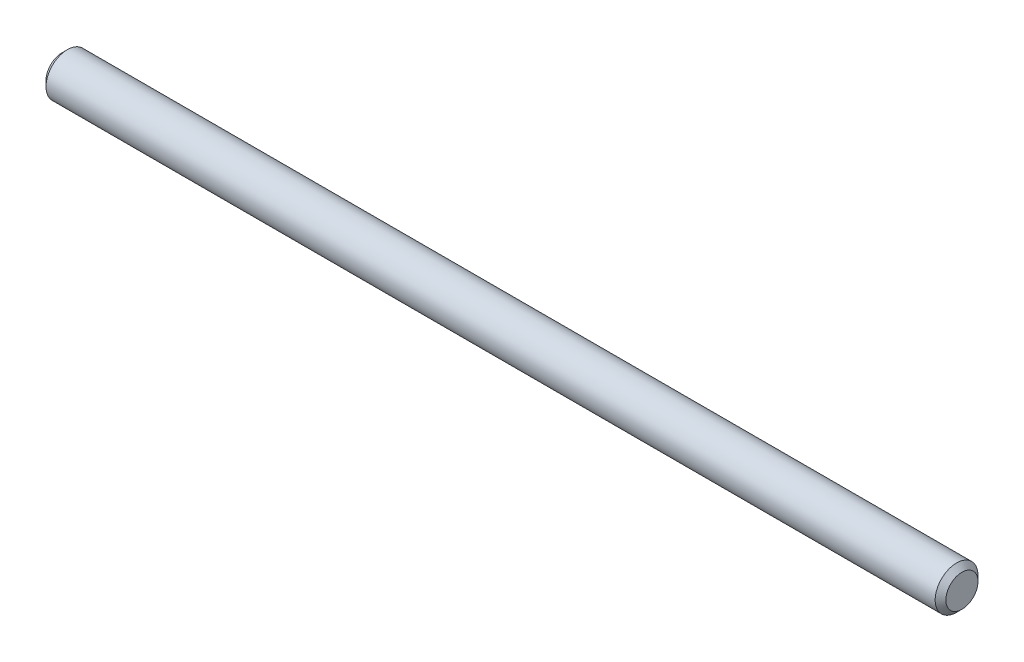
ISO-10303-21;
HEADER;
FILE_DESCRIPTION(('STEP AP214'),'2;1');
FILE_NAME('part.step','',(''),(''),'','','');
FILE_SCHEMA(('AUTOMOTIVE_DESIGN { 1 0 10303 214 1 1 1 1 }'));
ENDSEC;
DATA;
#1=APPLICATION_CONTEXT('core data for automotive mechanical design processes');
#2=APPLICATION_PROTOCOL_DEFINITION('international standard','automotive_design',2000,#1);
#3=PRODUCT_CONTEXT('',#1,'mechanical');
#4=PRODUCT('Part','Part','',(#3));
#5=PRODUCT_RELATED_PRODUCT_CATEGORY('part','',(#4));
#6=PRODUCT_DEFINITION_FORMATION('','',#4);
#7=PRODUCT_DEFINITION_CONTEXT('part definition',#1,'design');
#8=PRODUCT_DEFINITION('design','',#6,#7);
#9=PRODUCT_DEFINITION_SHAPE('','',#8);
#10=(LENGTH_UNIT() NAMED_UNIT(*) SI_UNIT(.MILLI.,.METRE.));
#11=(NAMED_UNIT(*) PLANE_ANGLE_UNIT() SI_UNIT($,.RADIAN.));
#12=(NAMED_UNIT(*) SI_UNIT($,.STERADIAN.) SOLID_ANGLE_UNIT());
#13=UNCERTAINTY_MEASURE_WITH_UNIT(LENGTH_MEASURE(1.E-05),#10,'distance_accuracy_value','');
#14=(GEOMETRIC_REPRESENTATION_CONTEXT(3) GLOBAL_UNCERTAINTY_ASSIGNED_CONTEXT((#13)) GLOBAL_UNIT_ASSIGNED_CONTEXT((#10,
#11,#12)) REPRESENTATION_CONTEXT('',''));
#15=CARTESIAN_POINT('',(0.,0.,0.));
#16=DIRECTION('',(0.,0.,1.));
#17=DIRECTION('',(1.,0.,0.));
#18=AXIS2_PLACEMENT_3D('',#15,#16,#17);
#19=CARTESIAN_POINT('',(42.,0.,0.));
#20=DIRECTION('',(-1.,0.,0.));
#21=DIRECTION('',(0.,0.,1.));
#22=AXIS2_PLACEMENT_3D('',#19,#20,#21);
#23=CYLINDRICAL_SURFACE('',#22,2.);
#24=CARTESIAN_POINT('',(-41.4999999999999,0.,0.));
#25=DIRECTION('',(1.,0.,0.));
#26=DIRECTION('',(0.,0.,-1.));
#27=AXIS2_PLACEMENT_3D('',#24,#25,#26);
#28=CIRCLE('',#27,2.);
#29=CARTESIAN_POINT('',(-41.4999999999999,0.,2.));
#30=VERTEX_POINT('',#29);
#31=EDGE_CURVE('E45',#30,#30,#28,.T.);
#32=CARTESIAN_POINT('',(41.5,0.,0.));
#33=DIRECTION('',(1.,0.,0.));
#34=DIRECTION('',(0.,0.,-1.));
#35=AXIS2_PLACEMENT_3D('',#32,#33,#34);
#36=CIRCLE('',#35,2.);
#37=CARTESIAN_POINT('',(41.5,0.,2.));
#38=VERTEX_POINT('',#37);
#39=EDGE_CURVE('E49',#38,#38,#36,.F.);
#40=CARTESIAN_POINT('',(-41.4999999999999,0.,2.));
#41=CARTESIAN_POINT('',(-40.6354166666666,0.,2.));
#42=CARTESIAN_POINT('',(-39.7708333333333,0.,2.));
#43=CARTESIAN_POINT('',(-38.0416666666666,0.,2.));
#44=CARTESIAN_POINT('',(-37.1770833333333,0.,2.));
#45=CARTESIAN_POINT('',(-35.4479166666666,0.,2.));
#46=CARTESIAN_POINT('',(-34.5833333333333,0.,2.));
#47=CARTESIAN_POINT('',(-32.8541666666666,0.,2.));
#48=CARTESIAN_POINT('',(-31.9895833333333,0.,2.));
#49=CARTESIAN_POINT('',(-30.2604166666666,0.,2.));
#50=CARTESIAN_POINT('',(-29.3958333333333,0.,2.));
#51=CARTESIAN_POINT('',(-27.6666666666666,0.,2.));
#52=CARTESIAN_POINT('',(-26.8020833333333,0.,2.));
#53=CARTESIAN_POINT('',(-25.0729166666666,0.,2.));
#54=CARTESIAN_POINT('',(-24.2083333333333,0.,2.));
#55=CARTESIAN_POINT('',(-22.4791666666666,0.,2.));
#56=CARTESIAN_POINT('',(-21.6145833333333,0.,2.));
#57=CARTESIAN_POINT('',(-19.8854166666666,0.,2.));
#58=CARTESIAN_POINT('',(-19.0208333333333,0.,2.));
#59=CARTESIAN_POINT('',(-17.2916666666666,0.,2.));
#60=CARTESIAN_POINT('',(-16.4270833333333,0.,2.));
#61=CARTESIAN_POINT('',(-14.6979166666666,0.,2.));
#62=CARTESIAN_POINT('',(-13.8333333333333,0.,2.));
#63=CARTESIAN_POINT('',(-12.1041666666666,0.,2.));
#64=CARTESIAN_POINT('',(-11.2395833333333,0.,2.));
#65=CARTESIAN_POINT('',(-9.51041666666662,0.,2.));
#66=CARTESIAN_POINT('',(-8.64583333333329,0.,2.));
#67=CARTESIAN_POINT('',(-6.91666666666662,0.,2.));
#68=CARTESIAN_POINT('',(-6.05208333333329,0.,2.));
#69=CARTESIAN_POINT('',(-4.32291666666662,0.,2.));
#70=CARTESIAN_POINT('',(-3.45833333333329,0.,2.));
#71=CARTESIAN_POINT('',(-1.72916666666662,0.,2.));
#72=CARTESIAN_POINT('',(-0.864583333333291,0.,2.));
#73=CARTESIAN_POINT('',(0.864583333333375,0.,2.));
#74=CARTESIAN_POINT('',(1.72916666666671,0.,2.));
#75=CARTESIAN_POINT('',(3.45833333333337,0.,2.));
#76=CARTESIAN_POINT('',(4.32291666666671,0.,2.));
#77=CARTESIAN_POINT('',(6.05208333333337,0.,2.));
#78=CARTESIAN_POINT('',(6.91666666666671,0.,2.));
#79=CARTESIAN_POINT('',(8.64583333333337,0.,2.));
#80=CARTESIAN_POINT('',(9.5104166666667,0.,2.));
#81=CARTESIAN_POINT('',(11.2395833333334,0.,2.));
#82=CARTESIAN_POINT('',(12.1041666666667,0.,2.));
#83=CARTESIAN_POINT('',(13.8333333333334,0.,2.));
#84=CARTESIAN_POINT('',(14.6979166666667,0.,2.));
#85=CARTESIAN_POINT('',(16.4270833333334,0.,2.));
#86=CARTESIAN_POINT('',(17.2916666666667,0.,2.));
#87=CARTESIAN_POINT('',(19.0208333333334,0.,2.));
#88=CARTESIAN_POINT('',(19.8854166666667,0.,2.));
#89=CARTESIAN_POINT('',(21.6145833333334,0.,2.));
#90=CARTESIAN_POINT('',(22.4791666666667,0.,2.));
#91=CARTESIAN_POINT('',(24.2083333333334,0.,2.));
#92=CARTESIAN_POINT('',(25.0729166666667,0.,2.));
#93=CARTESIAN_POINT('',(26.8020833333334,0.,2.));
#94=CARTESIAN_POINT('',(27.6666666666667,0.,2.));
#95=CARTESIAN_POINT('',(29.3958333333334,0.,2.));
#96=CARTESIAN_POINT('',(30.2604166666667,0.,2.));
#97=CARTESIAN_POINT('',(31.9895833333334,0.,2.));
#98=CARTESIAN_POINT('',(32.8541666666667,0.,2.));
#99=CARTESIAN_POINT('',(34.5833333333334,0.,2.));
#100=CARTESIAN_POINT('',(35.4479166666667,0.,2.));
#101=CARTESIAN_POINT('',(37.1770833333334,0.,2.));
#102=CARTESIAN_POINT('',(38.0416666666667,0.,2.));
#103=CARTESIAN_POINT('',(39.7708333333334,0.,2.));
#104=CARTESIAN_POINT('',(40.6354166666667,0.,2.));
#105=CARTESIAN_POINT('',(41.5,0.,2.));
#106=B_SPLINE_CURVE_WITH_KNOTS('',3,(#40,#41,#42,#43,#44,#45,#46,#47,#48,#49,#50,#51,#52,#53,
#54,#55,#56,#57,#58,#59,#60,#61,#62,#63,#64,#65,#66,#67,#68,#69,#70,#71,#72,#73,#74,#75,#76,#77,
#78,#79,#80,#81,#82,#83,#84,#85,#86,#87,#88,#89,#90,#91,#92,#93,#94,#95,#96,#97,#98,#99,#100,
#101,#102,#103,#104,#105),.UNSPECIFIED.,.F.,.F.,(4,2,2,2,2,2,2,2,2,2,2,2,2,2,2,2,2,2,2,2,2,2,2,
2,2,2,2,2,2,2,2,2,4),(0.,2.59375000000001,5.1875,7.78125,10.375,12.96875,15.5625,18.15625,20.75,
23.34375,25.9375,28.53125,31.125,33.71875,36.3125,38.90625,41.5,44.09375,46.6875,49.28125,
51.875,54.46875,57.0625,59.65625,62.25,64.84375,67.4375,70.03125,72.625,75.21875,77.8125,
80.40625,83.),.UNSPECIFIED.);
#107=EDGE_CURVE('BSEAM34',#30,#38,#106,.T.);
#108=ORIENTED_EDGE('',*,*,#31,.T.);
#109=ORIENTED_EDGE('',*,*,#39,.T.);
#110=ORIENTED_EDGE('',*,*,#107,.T.);
#111=ORIENTED_EDGE('',*,*,#107,.F.);
#112=EDGE_LOOP('',(#108,#110,#109,#111));
#113=FACE_BOUND('',#112,.T.);
#114=ADVANCED_FACE('F34',(#113),#23,.T.);
#115=CARTESIAN_POINT('',(42.,0.,0.));
#116=DIRECTION('',(1.,0.,0.));
#117=DIRECTION('',(0.,0.,-1.));
#118=AXIS2_PLACEMENT_3D('',#115,#116,#117);
#119=PLANE('',#118);
#120=CARTESIAN_POINT('',(42.,0.,0.));
#121=DIRECTION('',(1.,0.,0.));
#122=DIRECTION('',(0.,0.,-1.));
#123=AXIS2_PLACEMENT_3D('',#120,#121,#122);
#124=CIRCLE('',#123,1.50000000000003);
#125=CARTESIAN_POINT('',(42.,0.,-1.50000000000003));
#126=VERTEX_POINT('',#125);
#127=EDGE_CURVE('E10',#126,#126,#124,.T.);
#128=ORIENTED_EDGE('',*,*,#127,.T.);
#129=EDGE_LOOP('',(#128));
#130=FACE_BOUND('',#129,.T.);
#131=ADVANCED_FACE('F65',(#130),#119,.T.);
#132=CARTESIAN_POINT('',(-42.,0.,0.));
#133=DIRECTION('',(1.,0.,0.));
#134=DIRECTION('',(0.,0.,-1.));
#135=AXIS2_PLACEMENT_3D('',#132,#133,#134);
#136=PLANE('',#135);
#137=CARTESIAN_POINT('',(-42.,0.,0.));
#138=DIRECTION('',(1.,0.,0.));
#139=DIRECTION('',(0.,0.,-1.));
#140=AXIS2_PLACEMENT_3D('',#137,#138,#139);
#141=CIRCLE('',#140,1.49999999999992);
#142=CARTESIAN_POINT('',(-42.,0.,-1.49999999999992));
#143=VERTEX_POINT('',#142);
#144=EDGE_CURVE('E41',#143,#143,#141,.F.);
#145=ORIENTED_EDGE('',*,*,#144,.T.);
#146=EDGE_LOOP('',(#145));
#147=FACE_BOUND('',#146,.T.);
#148=ADVANCED_FACE('F62',(#147),#136,.F.);
#149=CARTESIAN_POINT('',(-41.4999999999999,0.,0.));
#150=DIRECTION('',(1.,0.,0.));
#151=DIRECTION('',(0.,0.,-1.));
#152=AXIS2_PLACEMENT_3D('',#149,#150,#151);
#153=CONICAL_SURFACE('',#152,2.,0.785398163397452);
#154=ORIENTED_EDGE('',*,*,#144,.F.);
#155=EDGE_LOOP('',(#154));
#156=FACE_BOUND('',#155,.T.);
#157=ORIENTED_EDGE('',*,*,#31,.F.);
#158=EDGE_LOOP('',(#157));
#159=FACE_BOUND('',#158,.T.);
#160=ADVANCED_FACE('F58',(#156,#159),#153,.T.);
#161=CARTESIAN_POINT('',(42.,0.,0.));
#162=DIRECTION('',(-1.,0.,0.));
#163=DIRECTION('',(0.,0.,1.));
#164=AXIS2_PLACEMENT_3D('',#161,#162,#163);
#165=CONICAL_SURFACE('',#164,1.50000000000003,0.785398163397452);
#166=ORIENTED_EDGE('',*,*,#39,.F.);
#167=EDGE_LOOP('',(#166));
#168=FACE_BOUND('',#167,.T.);
#169=ORIENTED_EDGE('',*,*,#127,.F.);
#170=EDGE_LOOP('',(#169));
#171=FACE_BOUND('',#170,.T.);
#172=ADVANCED_FACE('F36',(#168,#171),#165,.T.);
#173=CLOSED_SHELL('',(#114,#131,#148,#160,#172));
#174=MANIFOLD_SOLID_BREP('B2',#173);
#175=ADVANCED_BREP_SHAPE_REPRESENTATION('',(#18,#174),#14);
#176=SHAPE_DEFINITION_REPRESENTATION(#9,#175);
ENDSEC;
END-ISO-10303-21;
